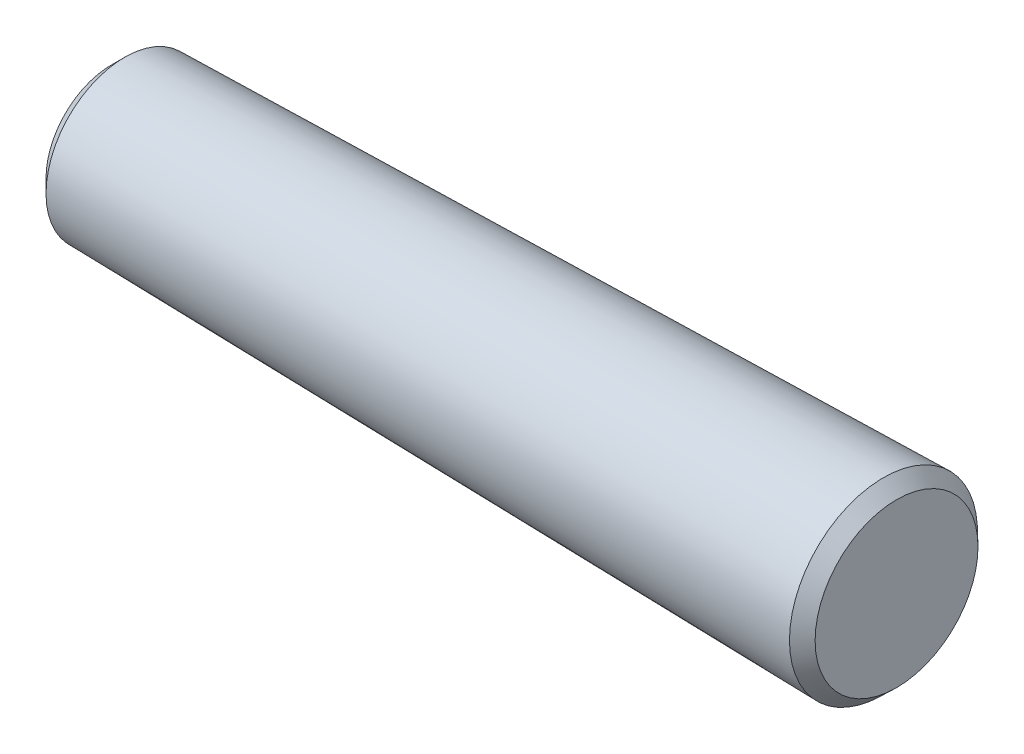
ISO-10303-21;
HEADER;
FILE_DESCRIPTION(('STEP AP214'),'2;1');
FILE_NAME('part.step','',(''),(''),'','','');
FILE_SCHEMA(('AUTOMOTIVE_DESIGN { 1 0 10303 214 1 1 1 1 }'));
ENDSEC;
DATA;
#1=APPLICATION_CONTEXT('core data for automotive mechanical design processes');
#2=APPLICATION_PROTOCOL_DEFINITION('international standard','automotive_design',2000,#1);
#3=PRODUCT_CONTEXT('',#1,'mechanical');
#4=PRODUCT('Part','Part','',(#3));
#5=PRODUCT_RELATED_PRODUCT_CATEGORY('part','',(#4));
#6=PRODUCT_DEFINITION_FORMATION('','',#4);
#7=PRODUCT_DEFINITION_CONTEXT('part definition',#1,'design');
#8=PRODUCT_DEFINITION('design','',#6,#7);
#9=PRODUCT_DEFINITION_SHAPE('','',#8);
#10=(LENGTH_UNIT() NAMED_UNIT(*) SI_UNIT(.MILLI.,.METRE.));
#11=(NAMED_UNIT(*) PLANE_ANGLE_UNIT() SI_UNIT($,.RADIAN.));
#12=(NAMED_UNIT(*) SI_UNIT($,.STERADIAN.) SOLID_ANGLE_UNIT());
#13=UNCERTAINTY_MEASURE_WITH_UNIT(LENGTH_MEASURE(1.E-05),#10,'distance_accuracy_value','');
#14=(GEOMETRIC_REPRESENTATION_CONTEXT(3) GLOBAL_UNCERTAINTY_ASSIGNED_CONTEXT((#13)) GLOBAL_UNIT_ASSIGNED_CONTEXT((#10,
#11,#12)) REPRESENTATION_CONTEXT('',''));
#15=CARTESIAN_POINT('',(0.,0.,0.));
#16=DIRECTION('',(0.,0.,1.));
#17=DIRECTION('',(1.,0.,0.));
#18=AXIS2_PLACEMENT_3D('',#15,#16,#17);
#19=CARTESIAN_POINT('',(0.,0.,0.));
#20=DIRECTION('',(-1.,0.,0.));
#21=DIRECTION('',(0.,0.,1.));
#22=AXIS2_PLACEMENT_3D('',#19,#20,#21);
#23=PLANE('',#22);
#24=CARTESIAN_POINT('',(0.,0.,0.));
#25=DIRECTION('',(-1.,0.,0.));
#26=DIRECTION('',(0.,0.,1.));
#27=AXIS2_PLACEMENT_3D('',#24,#25,#26);
#28=CIRCLE('',#27,2.49999999999999);
#29=CARTESIAN_POINT('',(0.,0.,2.49999999999999));
#30=VERTEX_POINT('',#29);
#31=EDGE_CURVE('E51',#30,#30,#28,.T.);
#32=ORIENTED_EDGE('',*,*,#31,.T.);
#33=EDGE_LOOP('',(#32));
#34=FACE_BOUND('',#33,.T.);
#35=ADVANCED_FACE('F43',(#34),#23,.T.);
#36=CARTESIAN_POINT('',(0.,0.,0.));
#37=DIRECTION('',(1.,0.,0.));
#38=DIRECTION('',(0.,0.,-1.));
#39=AXIS2_PLACEMENT_3D('',#36,#37,#38);
#40=CONICAL_SURFACE('',#39,3.,0.0200712863979348);
#41=CARTESIAN_POINT('',(0.510242600843813,0.,0.));
#42=DIRECTION('',(-1.,0.,0.));
#43=DIRECTION('',(0.,0.,1.));
#44=AXIS2_PLACEMENT_3D('',#41,#42,#43);
#45=CIRCLE('',#44,3.01024260084381);
#46=CARTESIAN_POINT('',(0.510242600843813,0.,3.01024260084381));
#47=VERTEX_POINT('',#46);
#48=EDGE_CURVE('E54',#47,#47,#45,.F.);
#49=ORIENTED_EDGE('',*,*,#48,.T.);
#50=EDGE_LOOP('',(#49));
#51=FACE_BOUND('',#50,.T.);
#52=CARTESIAN_POINT('',(29.5001007107533,0.,0.));
#53=DIRECTION('',(-1.,0.,0.));
#54=DIRECTION('',(0.,0.,1.));
#55=AXIS2_PLACEMENT_3D('',#52,#53,#54);
#56=CIRCLE('',#55,3.59218449406757);
#57=CARTESIAN_POINT('',(29.5001007107533,0.,3.59218449406757));
#58=VERTEX_POINT('',#57);
#59=EDGE_CURVE('E56',#58,#58,#56,.T.);
#60=ORIENTED_EDGE('',*,*,#59,.T.);
#61=EDGE_LOOP('',(#60));
#62=FACE_BOUND('',#61,.T.);
#63=ADVANCED_FACE('F65',(#51,#62),#40,.T.);
#64=CARTESIAN_POINT('',(30.,3.,0.));
#65=DIRECTION('',(1.,0.,0.));
#66=DIRECTION('',(0.,0.,-1.));
#67=AXIS2_PLACEMENT_3D('',#64,#65,#66);
#68=PLANE('',#67);
#69=CARTESIAN_POINT('',(30.,0.,0.));
#70=DIRECTION('',(1.,0.,0.));
#71=DIRECTION('',(0.,0.,-1.));
#72=AXIS2_PLACEMENT_3D('',#69,#70,#71);
#73=CIRCLE('',#72,3.11196018833728);
#74=CARTESIAN_POINT('',(30.,0.,-3.11196018833728));
#75=VERTEX_POINT('',#74);
#76=EDGE_CURVE('E10',#75,#75,#73,.T.);
#77=ORIENTED_EDGE('',*,*,#76,.T.);
#78=EDGE_LOOP('',(#77));
#79=FACE_BOUND('',#78,.T.);
#80=ADVANCED_FACE('F71',(#79),#68,.T.);
#81=CARTESIAN_POINT('',(0.510242600843817,0.,0.));
#82=DIRECTION('',(1.,0.,0.));
#83=DIRECTION('',(0.,0.,-1.));
#84=AXIS2_PLACEMENT_3D('',#81,#82,#83);
#85=CONICAL_SURFACE('',#84,3.01024260084381,0.785398163397451);
#86=ORIENTED_EDGE('',*,*,#31,.F.);
#87=EDGE_LOOP('',(#86));
#88=FACE_BOUND('',#87,.T.);
#89=ORIENTED_EDGE('',*,*,#48,.F.);
#90=EDGE_LOOP('',(#89));
#91=FACE_BOUND('',#90,.T.);
#92=ADVANCED_FACE('F70',(#88,#91),#85,.T.);
#93=CARTESIAN_POINT('',(30.,0.,0.));
#94=DIRECTION('',(-1.,0.,0.));
#95=DIRECTION('',(0.,0.,1.));
#96=AXIS2_PLACEMENT_3D('',#93,#94,#95);
#97=CONICAL_SURFACE('',#96,3.11196018833728,0.765326876999508);
#98=ORIENTED_EDGE('',*,*,#59,.F.);
#99=EDGE_LOOP('',(#98));
#100=FACE_BOUND('',#99,.T.);
#101=ORIENTED_EDGE('',*,*,#76,.F.);
#102=EDGE_LOOP('',(#101));
#103=FACE_BOUND('',#102,.T.);
#104=ADVANCED_FACE('F46',(#100,#103),#97,.T.);
#105=CLOSED_SHELL('',(#35,#63,#80,#92,#104));
#106=MANIFOLD_SOLID_BREP('B2',#105);
#107=ADVANCED_BREP_SHAPE_REPRESENTATION('',(#18,#106),#14);
#108=SHAPE_DEFINITION_REPRESENTATION(#9,#107);
ENDSEC;
END-ISO-10303-21;
